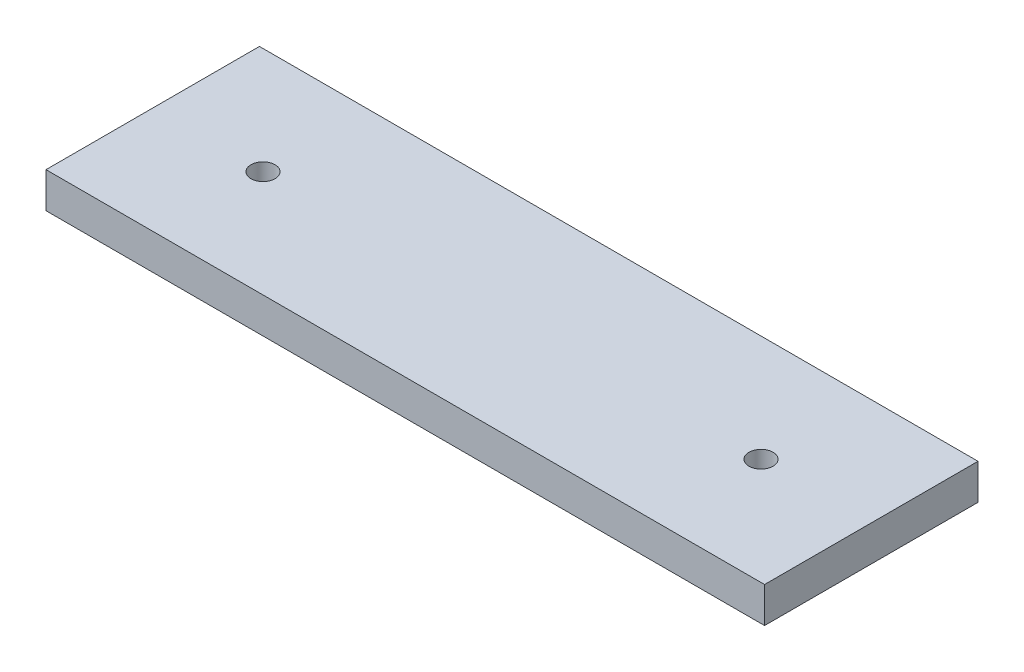
ISO-10303-21;
HEADER;
FILE_DESCRIPTION(('STEP AP214'),'2;1');
FILE_NAME('part.step','',(''),(''),'','','');
FILE_SCHEMA(('AUTOMOTIVE_DESIGN { 1 0 10303 214 1 1 1 1 }'));
ENDSEC;
DATA;
#1=APPLICATION_CONTEXT('core data for automotive mechanical design processes');
#2=APPLICATION_PROTOCOL_DEFINITION('international standard','automotive_design',2000,#1);
#3=PRODUCT_CONTEXT('',#1,'mechanical');
#4=PRODUCT('Part','Part','',(#3));
#5=PRODUCT_RELATED_PRODUCT_CATEGORY('part','',(#4));
#6=PRODUCT_DEFINITION_FORMATION('','',#4);
#7=PRODUCT_DEFINITION_CONTEXT('part definition',#1,'design');
#8=PRODUCT_DEFINITION('design','',#6,#7);
#9=PRODUCT_DEFINITION_SHAPE('','',#8);
#10=(LENGTH_UNIT() NAMED_UNIT(*) SI_UNIT(.MILLI.,.METRE.));
#11=(NAMED_UNIT(*) PLANE_ANGLE_UNIT() SI_UNIT($,.RADIAN.));
#12=(NAMED_UNIT(*) SI_UNIT($,.STERADIAN.) SOLID_ANGLE_UNIT());
#13=UNCERTAINTY_MEASURE_WITH_UNIT(LENGTH_MEASURE(1.E-05),#10,'distance_accuracy_value','');
#14=(GEOMETRIC_REPRESENTATION_CONTEXT(3) GLOBAL_UNCERTAINTY_ASSIGNED_CONTEXT((#13)) GLOBAL_UNIT_ASSIGNED_CONTEXT((#10,
#11,#12)) REPRESENTATION_CONTEXT('',''));
#15=CARTESIAN_POINT('',(0.,0.,0.));
#16=DIRECTION('',(0.,0.,1.));
#17=DIRECTION('',(1.,0.,0.));
#18=AXIS2_PLACEMENT_3D('',#15,#16,#17);
#19=CARTESIAN_POINT('',(0.,-30.,0.));
#20=DIRECTION('',(0.,-1.,0.));
#21=DIRECTION('',(0.,0.,-1.));
#22=AXIS2_PLACEMENT_3D('',#19,#20,#21);
#23=PLANE('',#22);
#24=DIRECTION('',(1.,0.,0.));
#25=VECTOR('',#24,1.);
#26=CARTESIAN_POINT('',(640.,-30.,380.));
#27=LINE('',#26,#25);
#28=CARTESIAN_POINT('',(640.,-30.,380.));
#29=VERTEX_POINT('',#28);
#30=CARTESIAN_POINT('',(438.,-30.,380.));
#31=VERTEX_POINT('',#30);
#32=EDGE_CURVE('E88',#29,#31,#27,.F.);
#33=ORIENTED_EDGE('',*,*,#32,.T.);
#34=DIRECTION('',(0.,0.,-1.));
#35=VECTOR('',#34,1.);
#36=CARTESIAN_POINT('',(438.,-30.,380.));
#37=LINE('',#36,#35);
#38=CARTESIAN_POINT('',(438.,-30.,440.));
#39=VERTEX_POINT('',#38);
#40=EDGE_CURVE('E71',#31,#39,#37,.F.);
#41=ORIENTED_EDGE('',*,*,#40,.T.);
#42=DIRECTION('',(1.,0.,0.));
#43=VECTOR('',#42,1.);
#44=CARTESIAN_POINT('',(640.,-30.,440.));
#45=LINE('',#44,#43);
#46=CARTESIAN_POINT('',(640.,-30.,440.));
#47=VERTEX_POINT('',#46);
#48=EDGE_CURVE('E54',#39,#47,#45,.T.);
#49=ORIENTED_EDGE('',*,*,#48,.T.);
#50=DIRECTION('',(0.,0.,1.));
#51=VECTOR('',#50,1.);
#52=CARTESIAN_POINT('',(640.,-30.,380.));
#53=LINE('',#52,#51);
#54=EDGE_CURVE('E59',#47,#29,#53,.F.);
#55=ORIENTED_EDGE('',*,*,#54,.T.);
#56=EDGE_LOOP('',(#33,#41,#49,#55));
#57=FACE_BOUND('',#56,.T.);
#58=CARTESIAN_POINT('',(469.,-30.,410.));
#59=DIRECTION('',(0.,-1.,0.));
#60=DIRECTION('',(0.,0.,-1.));
#61=AXIS2_PLACEMENT_3D('',#58,#59,#60);
#62=CIRCLE('',#61,3.40000000000001);
#63=CARTESIAN_POINT('',(469.,-30.,406.6));
#64=VERTEX_POINT('',#63);
#65=EDGE_CURVE('E68',#64,#64,#62,.T.);
#66=ORIENTED_EDGE('',*,*,#65,.T.);
#67=EDGE_LOOP('',(#66));
#68=FACE_BOUND('',#67,.T.);
#69=CARTESIAN_POINT('',(609.,-30.,410.));
#70=DIRECTION('',(0.,-1.,0.));
#71=DIRECTION('',(0.,0.,-1.));
#72=AXIS2_PLACEMENT_3D('',#69,#70,#71);
#73=CIRCLE('',#72,3.39999999999996);
#74=CARTESIAN_POINT('',(609.,-30.,406.6));
#75=VERTEX_POINT('',#74);
#76=EDGE_CURVE('E19',#75,#75,#73,.T.);
#77=ORIENTED_EDGE('',*,*,#76,.T.);
#78=EDGE_LOOP('',(#77));
#79=FACE_BOUND('',#78,.T.);
#80=ADVANCED_FACE('F16',(#57,#68,#79),#23,.F.);
#81=CARTESIAN_POINT('',(609.,-40.,410.));
#82=DIRECTION('',(0.,-1.,0.));
#83=DIRECTION('',(0.,0.,-1.));
#84=AXIS2_PLACEMENT_3D('',#81,#82,#83);
#85=CYLINDRICAL_SURFACE('',#84,3.39999999999996);
#86=CARTESIAN_POINT('',(609.,-40.,410.));
#87=DIRECTION('',(0.,-1.,0.));
#88=DIRECTION('',(0.,0.,-1.));
#89=AXIS2_PLACEMENT_3D('',#86,#87,#88);
#90=CIRCLE('',#89,3.39999999999996);
#91=CARTESIAN_POINT('',(609.,-40.,406.6));
#92=VERTEX_POINT('',#91);
#93=EDGE_CURVE('E86',#92,#92,#90,.F.);
#94=ORIENTED_EDGE('',*,*,#93,.F.);
#95=EDGE_LOOP('',(#94));
#96=FACE_BOUND('',#95,.T.);
#97=ORIENTED_EDGE('',*,*,#76,.F.);
#98=EDGE_LOOP('',(#97));
#99=FACE_BOUND('',#98,.T.);
#100=ADVANCED_FACE('F95',(#96,#99),#85,.F.);
#101=CARTESIAN_POINT('',(469.,-40.,410.));
#102=DIRECTION('',(0.,-1.,0.));
#103=DIRECTION('',(0.,0.,-1.));
#104=AXIS2_PLACEMENT_3D('',#101,#102,#103);
#105=CYLINDRICAL_SURFACE('',#104,3.40000000000001);
#106=CARTESIAN_POINT('',(469.,-40.,410.));
#107=DIRECTION('',(0.,-1.,0.));
#108=DIRECTION('',(0.,0.,-1.));
#109=AXIS2_PLACEMENT_3D('',#106,#107,#108);
#110=CIRCLE('',#109,3.40000000000001);
#111=CARTESIAN_POINT('',(469.,-40.,406.6));
#112=VERTEX_POINT('',#111);
#113=EDGE_CURVE('E82',#112,#112,#110,.F.);
#114=ORIENTED_EDGE('',*,*,#113,.F.);
#115=EDGE_LOOP('',(#114));
#116=FACE_BOUND('',#115,.T.);
#117=ORIENTED_EDGE('',*,*,#65,.F.);
#118=EDGE_LOOP('',(#117));
#119=FACE_BOUND('',#118,.T.);
#120=ADVANCED_FACE('F97',(#116,#119),#105,.F.);
#121=CARTESIAN_POINT('',(640.,-40.,380.));
#122=DIRECTION('',(-1.,0.,0.));
#123=DIRECTION('',(0.,0.,1.));
#124=AXIS2_PLACEMENT_3D('',#121,#122,#123);
#125=PLANE('',#124);
#126=DIRECTION('',(0.,1.,0.));
#127=VECTOR('',#126,1.);
#128=CARTESIAN_POINT('',(640.,-40.,440.));
#129=LINE('',#128,#127);
#130=CARTESIAN_POINT('',(640.,-40.,440.));
#131=VERTEX_POINT('',#130);
#132=EDGE_CURVE('E61',#47,#131,#129,.F.);
#133=ORIENTED_EDGE('',*,*,#132,.T.);
#134=DIRECTION('',(0.,0.,-1.));
#135=VECTOR('',#134,1.);
#136=CARTESIAN_POINT('',(640.,-40.,0.));
#137=LINE('',#136,#135);
#138=CARTESIAN_POINT('',(640.,-40.,380.));
#139=VERTEX_POINT('',#138);
#140=EDGE_CURVE('E85',#139,#131,#137,.F.);
#141=ORIENTED_EDGE('',*,*,#140,.F.);
#142=DIRECTION('',(0.,-1.,0.));
#143=VECTOR('',#142,1.);
#144=CARTESIAN_POINT('',(640.,-40.,380.));
#145=LINE('',#144,#143);
#146=EDGE_CURVE('E64',#139,#29,#145,.F.);
#147=ORIENTED_EDGE('',*,*,#146,.T.);
#148=ORIENTED_EDGE('',*,*,#54,.F.);
#149=EDGE_LOOP('',(#133,#141,#147,#148));
#150=FACE_BOUND('',#149,.T.);
#151=ADVANCED_FACE('F60',(#150),#125,.F.);
#152=CARTESIAN_POINT('',(640.,-40.,440.));
#153=DIRECTION('',(0.,0.,-1.));
#154=DIRECTION('',(0.,1.,0.));
#155=AXIS2_PLACEMENT_3D('',#152,#153,#154);
#156=PLANE('',#155);
#157=DIRECTION('',(0.,1.,0.));
#158=VECTOR('',#157,1.);
#159=CARTESIAN_POINT('',(438.,-40.,440.));
#160=LINE('',#159,#158);
#161=CARTESIAN_POINT('',(438.,-40.,440.));
#162=VERTEX_POINT('',#161);
#163=EDGE_CURVE('E73',#39,#162,#160,.F.);
#164=ORIENTED_EDGE('',*,*,#163,.T.);
#165=DIRECTION('',(1.,0.,0.));
#166=VECTOR('',#165,1.);
#167=CARTESIAN_POINT('',(0.,-40.,440.));
#168=LINE('',#167,#166);
#169=EDGE_CURVE('E77',#131,#162,#168,.F.);
#170=ORIENTED_EDGE('',*,*,#169,.F.);
#171=ORIENTED_EDGE('',*,*,#132,.F.);
#172=ORIENTED_EDGE('',*,*,#48,.F.);
#173=EDGE_LOOP('',(#164,#170,#171,#172));
#174=FACE_BOUND('',#173,.T.);
#175=ADVANCED_FACE('F75',(#174),#156,.F.);
#176=CARTESIAN_POINT('',(438.,-40.,380.));
#177=DIRECTION('',(1.,0.,0.));
#178=DIRECTION('',(0.,0.,-1.));
#179=AXIS2_PLACEMENT_3D('',#176,#177,#178);
#180=PLANE('',#179);
#181=DIRECTION('',(0.,-1.,0.));
#182=VECTOR('',#181,1.);
#183=CARTESIAN_POINT('',(438.,-40.,380.));
#184=LINE('',#183,#182);
#185=CARTESIAN_POINT('',(438.,-40.,380.));
#186=VERTEX_POINT('',#185);
#187=EDGE_CURVE('E34',#31,#186,#184,.T.);
#188=ORIENTED_EDGE('',*,*,#187,.T.);
#189=DIRECTION('',(0.,0.,-1.));
#190=VECTOR('',#189,1.);
#191=CARTESIAN_POINT('',(438.,-40.,0.));
#192=LINE('',#191,#190);
#193=EDGE_CURVE('E25',#162,#186,#192,.T.);
#194=ORIENTED_EDGE('',*,*,#193,.F.);
#195=ORIENTED_EDGE('',*,*,#163,.F.);
#196=ORIENTED_EDGE('',*,*,#40,.F.);
#197=EDGE_LOOP('',(#188,#194,#195,#196));
#198=FACE_BOUND('',#197,.T.);
#199=ADVANCED_FACE('F115',(#198),#180,.F.);
#200=CARTESIAN_POINT('',(640.,-40.,380.));
#201=DIRECTION('',(0.,0.,1.));
#202=DIRECTION('',(0.,-1.,0.));
#203=AXIS2_PLACEMENT_3D('',#200,#201,#202);
#204=PLANE('',#203);
#205=ORIENTED_EDGE('',*,*,#146,.F.);
#206=DIRECTION('',(1.,0.,0.));
#207=VECTOR('',#206,1.);
#208=CARTESIAN_POINT('',(0.,-40.,380.));
#209=LINE('',#208,#207);
#210=EDGE_CURVE('E11',#186,#139,#209,.T.);
#211=ORIENTED_EDGE('',*,*,#210,.F.);
#212=ORIENTED_EDGE('',*,*,#187,.F.);
#213=ORIENTED_EDGE('',*,*,#32,.F.);
#214=EDGE_LOOP('',(#205,#211,#212,#213));
#215=FACE_BOUND('',#214,.T.);
#216=ADVANCED_FACE('F109',(#215),#204,.F.);
#217=CARTESIAN_POINT('',(0.,-40.,0.));
#218=DIRECTION('',(0.,-1.,0.));
#219=DIRECTION('',(0.,0.,-1.));
#220=AXIS2_PLACEMENT_3D('',#217,#218,#219);
#221=PLANE('',#220);
#222=ORIENTED_EDGE('',*,*,#193,.T.);
#223=ORIENTED_EDGE('',*,*,#210,.T.);
#224=ORIENTED_EDGE('',*,*,#140,.T.);
#225=ORIENTED_EDGE('',*,*,#169,.T.);
#226=EDGE_LOOP('',(#222,#223,#224,#225));
#227=FACE_BOUND('',#226,.T.);
#228=ORIENTED_EDGE('',*,*,#113,.T.);
#229=EDGE_LOOP('',(#228));
#230=FACE_BOUND('',#229,.T.);
#231=ORIENTED_EDGE('',*,*,#93,.T.);
#232=EDGE_LOOP('',(#231));
#233=FACE_BOUND('',#232,.T.);
#234=ADVANCED_FACE('F107',(#227,#230,#233),#221,.T.);
#235=CLOSED_SHELL('',(#80,#100,#120,#151,#175,#199,#216,#234));
#236=MANIFOLD_SOLID_BREP('B1',#235);
#237=ADVANCED_BREP_SHAPE_REPRESENTATION('',(#18,#236),#14);
#238=SHAPE_DEFINITION_REPRESENTATION(#9,#237);
ENDSEC;
END-ISO-10303-21;
